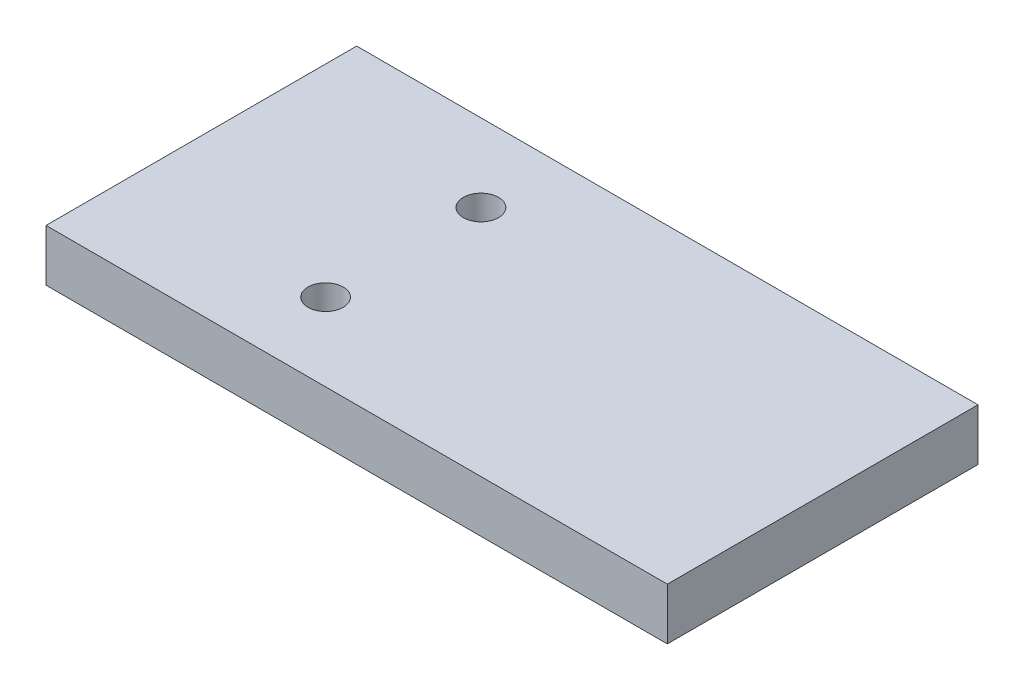
ISO-10303-21;
HEADER;
FILE_DESCRIPTION(('STEP AP214'),'2;1');
FILE_NAME('part.step','',(''),(''),'','','');
FILE_SCHEMA(('AUTOMOTIVE_DESIGN { 1 0 10303 214 1 1 1 1 }'));
ENDSEC;
DATA;
#1=APPLICATION_CONTEXT('core data for automotive mechanical design processes');
#2=APPLICATION_PROTOCOL_DEFINITION('international standard','automotive_design',2000,#1);
#3=PRODUCT_CONTEXT('',#1,'mechanical');
#4=PRODUCT('Part','Part','',(#3));
#5=PRODUCT_RELATED_PRODUCT_CATEGORY('part','',(#4));
#6=PRODUCT_DEFINITION_FORMATION('','',#4);
#7=PRODUCT_DEFINITION_CONTEXT('part definition',#1,'design');
#8=PRODUCT_DEFINITION('design','',#6,#7);
#9=PRODUCT_DEFINITION_SHAPE('','',#8);
#10=(LENGTH_UNIT() NAMED_UNIT(*) SI_UNIT(.MILLI.,.METRE.));
#11=(NAMED_UNIT(*) PLANE_ANGLE_UNIT() SI_UNIT($,.RADIAN.));
#12=(NAMED_UNIT(*) SI_UNIT($,.STERADIAN.) SOLID_ANGLE_UNIT());
#13=UNCERTAINTY_MEASURE_WITH_UNIT(LENGTH_MEASURE(1.E-05),#10,'distance_accuracy_value','');
#14=(GEOMETRIC_REPRESENTATION_CONTEXT(3) GLOBAL_UNCERTAINTY_ASSIGNED_CONTEXT((#13)) GLOBAL_UNIT_ASSIGNED_CONTEXT((#10,
#11,#12)) REPRESENTATION_CONTEXT('',''));
#15=CARTESIAN_POINT('',(0.,0.,0.));
#16=DIRECTION('',(0.,0.,1.));
#17=DIRECTION('',(1.,0.,0.));
#18=AXIS2_PLACEMENT_3D('',#15,#16,#17);
#19=CARTESIAN_POINT('',(0.,270.,0.));
#20=DIRECTION('',(0.,1.,0.));
#21=DIRECTION('',(0.,0.,1.));
#22=AXIS2_PLACEMENT_3D('',#19,#20,#21);
#23=PLANE('',#22);
#24=DIRECTION('',(0.,0.,1.));
#25=VECTOR('',#24,1.);
#26=CARTESIAN_POINT('',(-381.,270.,-820.));
#27=LINE('',#26,#25);
#28=CARTESIAN_POINT('',(-381.,270.,-760.));
#29=VERTEX_POINT('',#28);
#30=CARTESIAN_POINT('',(-381.,270.,-820.));
#31=VERTEX_POINT('',#30);
#32=EDGE_CURVE('E54',#29,#31,#27,.F.);
#33=ORIENTED_EDGE('',*,*,#32,.T.);
#34=DIRECTION('',(1.,0.,0.));
#35=VECTOR('',#34,1.);
#36=CARTESIAN_POINT('',(-501.,270.,-820.));
#37=LINE('',#36,#35);
#38=CARTESIAN_POINT('',(-501.,270.,-820.));
#39=VERTEX_POINT('',#38);
#40=EDGE_CURVE('E177',#31,#39,#37,.F.);
#41=ORIENTED_EDGE('',*,*,#40,.T.);
#42=DIRECTION('',(0.,0.,-1.));
#43=VECTOR('',#42,1.);
#44=CARTESIAN_POINT('',(-501.,270.,-820.));
#45=LINE('',#44,#43);
#46=CARTESIAN_POINT('',(-501.,270.,-760.));
#47=VERTEX_POINT('',#46);
#48=EDGE_CURVE('E59',#39,#47,#45,.F.);
#49=ORIENTED_EDGE('',*,*,#48,.T.);
#50=DIRECTION('',(1.,0.,0.));
#51=VECTOR('',#50,1.);
#52=CARTESIAN_POINT('',(-501.,270.,-760.));
#53=LINE('',#52,#51);
#54=EDGE_CURVE('E57',#47,#29,#53,.T.);
#55=ORIENTED_EDGE('',*,*,#54,.T.);
#56=EDGE_LOOP('',(#33,#41,#49,#55));
#57=FACE_BOUND('',#56,.T.);
#58=CARTESIAN_POINT('',(-462.,270.,-775.));
#59=DIRECTION('',(0.,-1.,0.));
#60=DIRECTION('',(0.,0.,-1.));
#61=AXIS2_PLACEMENT_3D('',#58,#59,#60);
#62=CIRCLE('',#61,3.39999999999996);
#63=CARTESIAN_POINT('',(-462.,270.,-778.4));
#64=VERTEX_POINT('',#63);
#65=EDGE_CURVE('E65',#64,#64,#62,.T.);
#66=ORIENTED_EDGE('',*,*,#65,.T.);
#67=EDGE_LOOP('',(#66));
#68=FACE_BOUND('',#67,.T.);
#69=CARTESIAN_POINT('',(-462.,270.,-805.));
#70=DIRECTION('',(0.,-1.,0.));
#71=DIRECTION('',(0.,0.,-1.));
#72=AXIS2_PLACEMENT_3D('',#69,#70,#71);
#73=CIRCLE('',#72,3.39999999999996);
#74=CARTESIAN_POINT('',(-462.,270.,-808.4));
#75=VERTEX_POINT('',#74);
#76=EDGE_CURVE('E19',#75,#75,#73,.T.);
#77=ORIENTED_EDGE('',*,*,#76,.T.);
#78=EDGE_LOOP('',(#77));
#79=FACE_BOUND('',#78,.T.);
#80=ADVANCED_FACE('F16',(#57,#68,#79),#23,.T.);
#81=CARTESIAN_POINT('',(-462.,260.,-805.));
#82=DIRECTION('',(0.,-1.,0.));
#83=DIRECTION('',(0.,0.,-1.));
#84=AXIS2_PLACEMENT_3D('',#81,#82,#83);
#85=CYLINDRICAL_SURFACE('',#84,3.39999999999996);
#86=ORIENTED_EDGE('',*,*,#76,.F.);
#87=EDGE_LOOP('',(#86));
#88=FACE_BOUND('',#87,.T.);
#89=CARTESIAN_POINT('',(-462.,260.,-805.));
#90=DIRECTION('',(0.,-1.,0.));
#91=DIRECTION('',(0.,0.,-1.));
#92=AXIS2_PLACEMENT_3D('',#89,#90,#91);
#93=CIRCLE('',#92,3.39999999999996);
#94=CARTESIAN_POINT('',(-462.,260.,-808.4));
#95=VERTEX_POINT('',#94);
#96=EDGE_CURVE('E83',#95,#95,#93,.T.);
#97=ORIENTED_EDGE('',*,*,#96,.T.);
#98=EDGE_LOOP('',(#97));
#99=FACE_BOUND('',#98,.T.);
#100=ADVANCED_FACE('F91',(#88,#99),#85,.F.);
#101=CARTESIAN_POINT('',(-462.,260.,-775.));
#102=DIRECTION('',(0.,-1.,0.));
#103=DIRECTION('',(0.,0.,-1.));
#104=AXIS2_PLACEMENT_3D('',#101,#102,#103);
#105=CYLINDRICAL_SURFACE('',#104,3.39999999999996);
#106=ORIENTED_EDGE('',*,*,#65,.F.);
#107=EDGE_LOOP('',(#106));
#108=FACE_BOUND('',#107,.T.);
#109=CARTESIAN_POINT('',(-462.,260.,-775.));
#110=DIRECTION('',(0.,-1.,0.));
#111=DIRECTION('',(0.,0.,-1.));
#112=AXIS2_PLACEMENT_3D('',#109,#110,#111);
#113=CIRCLE('',#112,3.39999999999996);
#114=CARTESIAN_POINT('',(-462.,260.,-778.4));
#115=VERTEX_POINT('',#114);
#116=EDGE_CURVE('E80',#115,#115,#113,.T.);
#117=ORIENTED_EDGE('',*,*,#116,.T.);
#118=EDGE_LOOP('',(#117));
#119=FACE_BOUND('',#118,.T.);
#120=ADVANCED_FACE('F94',(#108,#119),#105,.F.);
#121=CARTESIAN_POINT('',(-501.,260.,-760.));
#122=DIRECTION('',(0.,0.,-1.));
#123=DIRECTION('',(0.,1.,0.));
#124=AXIS2_PLACEMENT_3D('',#121,#122,#123);
#125=PLANE('',#124);
#126=DIRECTION('',(0.,1.,0.));
#127=VECTOR('',#126,1.);
#128=CARTESIAN_POINT('',(-501.,260.,-760.));
#129=LINE('',#128,#127);
#130=CARTESIAN_POINT('',(-501.,260.,-760.));
#131=VERTEX_POINT('',#130);
#132=EDGE_CURVE('E185',#47,#131,#129,.F.);
#133=ORIENTED_EDGE('',*,*,#132,.T.);
#134=DIRECTION('',(1.,0.,0.));
#135=VECTOR('',#134,1.);
#136=CARTESIAN_POINT('',(0.,260.,-760.));
#137=LINE('',#136,#135);
#138=CARTESIAN_POINT('',(-381.,260.,-760.));
#139=VERTEX_POINT('',#138);
#140=EDGE_CURVE('E76',#131,#139,#137,.T.);
#141=ORIENTED_EDGE('',*,*,#140,.T.);
#142=DIRECTION('',(0.,1.,0.));
#143=VECTOR('',#142,1.);
#144=CARTESIAN_POINT('',(-381.,260.,-760.));
#145=LINE('',#144,#143);
#146=EDGE_CURVE('E64',#139,#29,#145,.T.);
#147=ORIENTED_EDGE('',*,*,#146,.T.);
#148=ORIENTED_EDGE('',*,*,#54,.F.);
#149=EDGE_LOOP('',(#133,#141,#147,#148));
#150=FACE_BOUND('',#149,.T.);
#151=ADVANCED_FACE('F75',(#150),#125,.F.);
#152=CARTESIAN_POINT('',(-381.,260.,-820.));
#153=DIRECTION('',(-1.,0.,0.));
#154=DIRECTION('',(0.,0.,1.));
#155=AXIS2_PLACEMENT_3D('',#152,#153,#154);
#156=PLANE('',#155);
#157=ORIENTED_EDGE('',*,*,#146,.F.);
#158=DIRECTION('',(0.,0.,1.));
#159=VECTOR('',#158,1.);
#160=CARTESIAN_POINT('',(-381.,260.,0.));
#161=LINE('',#160,#159);
#162=CARTESIAN_POINT('',(-381.,260.,-820.));
#163=VERTEX_POINT('',#162);
#164=EDGE_CURVE('E178',#139,#163,#161,.F.);
#165=ORIENTED_EDGE('',*,*,#164,.T.);
#166=DIRECTION('',(0.,-1.,0.));
#167=VECTOR('',#166,1.);
#168=CARTESIAN_POINT('',(-381.,260.,-820.));
#169=LINE('',#168,#167);
#170=EDGE_CURVE('E72',#163,#31,#169,.F.);
#171=ORIENTED_EDGE('',*,*,#170,.T.);
#172=ORIENTED_EDGE('',*,*,#32,.F.);
#173=EDGE_LOOP('',(#157,#165,#171,#172));
#174=FACE_BOUND('',#173,.T.);
#175=ADVANCED_FACE('F69',(#174),#156,.F.);
#176=CARTESIAN_POINT('',(-501.,260.,-820.));
#177=DIRECTION('',(0.,0.,1.));
#178=DIRECTION('',(0.,-1.,0.));
#179=AXIS2_PLACEMENT_3D('',#176,#177,#178);
#180=PLANE('',#179);
#181=ORIENTED_EDGE('',*,*,#170,.F.);
#182=DIRECTION('',(1.,0.,0.));
#183=VECTOR('',#182,1.);
#184=CARTESIAN_POINT('',(0.,260.,-820.));
#185=LINE('',#184,#183);
#186=CARTESIAN_POINT('',(-501.,260.,-820.));
#187=VERTEX_POINT('',#186);
#188=EDGE_CURVE('E25',#163,#187,#185,.F.);
#189=ORIENTED_EDGE('',*,*,#188,.T.);
#190=DIRECTION('',(0.,1.,0.));
#191=VECTOR('',#190,1.);
#192=CARTESIAN_POINT('',(-501.,260.,-820.));
#193=LINE('',#192,#191);
#194=EDGE_CURVE('E33',#187,#39,#193,.T.);
#195=ORIENTED_EDGE('',*,*,#194,.T.);
#196=ORIENTED_EDGE('',*,*,#40,.F.);
#197=EDGE_LOOP('',(#181,#189,#195,#196));
#198=FACE_BOUND('',#197,.T.);
#199=ADVANCED_FACE('F106',(#198),#180,.F.);
#200=CARTESIAN_POINT('',(-501.,260.,-820.));
#201=DIRECTION('',(1.,0.,0.));
#202=DIRECTION('',(0.,0.,-1.));
#203=AXIS2_PLACEMENT_3D('',#200,#201,#202);
#204=PLANE('',#203);
#205=ORIENTED_EDGE('',*,*,#194,.F.);
#206=DIRECTION('',(0.,0.,1.));
#207=VECTOR('',#206,1.);
#208=CARTESIAN_POINT('',(-501.,260.,0.));
#209=LINE('',#208,#207);
#210=EDGE_CURVE('E11',#187,#131,#209,.T.);
#211=ORIENTED_EDGE('',*,*,#210,.T.);
#212=ORIENTED_EDGE('',*,*,#132,.F.);
#213=ORIENTED_EDGE('',*,*,#48,.F.);
#214=EDGE_LOOP('',(#205,#211,#212,#213));
#215=FACE_BOUND('',#214,.T.);
#216=ADVANCED_FACE('F99',(#215),#204,.F.);
#217=CARTESIAN_POINT('',(0.,260.,0.));
#218=DIRECTION('',(0.,1.,0.));
#219=DIRECTION('',(0.,0.,1.));
#220=AXIS2_PLACEMENT_3D('',#217,#218,#219);
#221=PLANE('',#220);
#222=ORIENTED_EDGE('',*,*,#188,.F.);
#223=ORIENTED_EDGE('',*,*,#164,.F.);
#224=ORIENTED_EDGE('',*,*,#140,.F.);
#225=ORIENTED_EDGE('',*,*,#210,.F.);
#226=EDGE_LOOP('',(#222,#223,#224,#225));
#227=FACE_BOUND('',#226,.T.);
#228=ORIENTED_EDGE('',*,*,#116,.F.);
#229=EDGE_LOOP('',(#228));
#230=FACE_BOUND('',#229,.T.);
#231=ORIENTED_EDGE('',*,*,#96,.F.);
#232=EDGE_LOOP('',(#231));
#233=FACE_BOUND('',#232,.T.);
#234=ADVANCED_FACE('F97',(#227,#230,#233),#221,.F.);
#235=CLOSED_SHELL('',(#80,#100,#120,#151,#175,#199,#216,#234));
#236=MANIFOLD_SOLID_BREP('B1',#235);
#237=ADVANCED_BREP_SHAPE_REPRESENTATION('',(#18,#236),#14);
#238=SHAPE_DEFINITION_REPRESENTATION(#9,#237);
ENDSEC;
END-ISO-10303-21;
